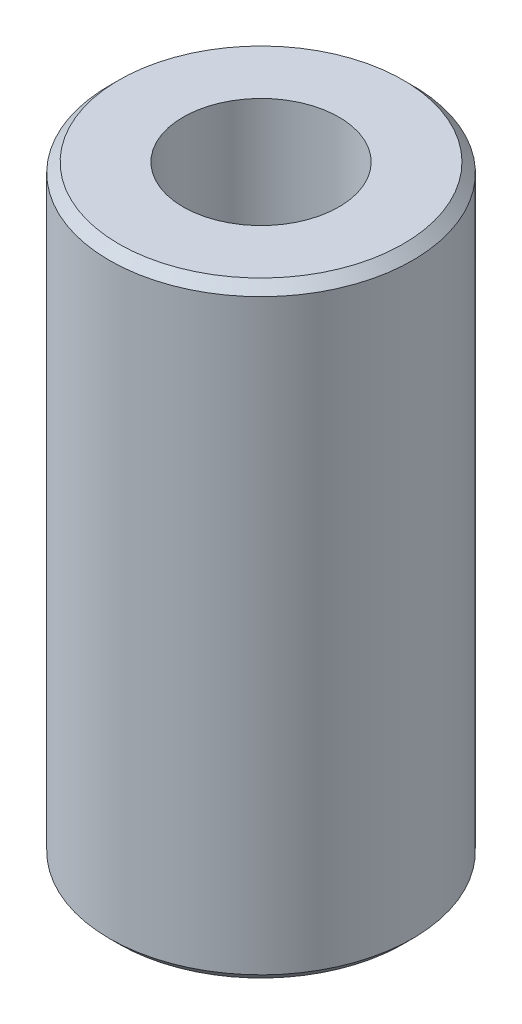
ISO-10303-21;
HEADER;
FILE_DESCRIPTION(('STEP AP214'),'2;1');
FILE_NAME('part.step','',(''),(''),'','','');
FILE_SCHEMA(('AUTOMOTIVE_DESIGN { 1 0 10303 214 1 1 1 1 }'));
ENDSEC;
DATA;
#1=APPLICATION_CONTEXT('core data for automotive mechanical design processes');
#2=APPLICATION_PROTOCOL_DEFINITION('international standard','automotive_design',2000,#1);
#3=PRODUCT_CONTEXT('',#1,'mechanical');
#4=PRODUCT('Part','Part','',(#3));
#5=PRODUCT_RELATED_PRODUCT_CATEGORY('part','',(#4));
#6=PRODUCT_DEFINITION_FORMATION('','',#4);
#7=PRODUCT_DEFINITION_CONTEXT('part definition',#1,'design');
#8=PRODUCT_DEFINITION('design','',#6,#7);
#9=PRODUCT_DEFINITION_SHAPE('','',#8);
#10=(LENGTH_UNIT() NAMED_UNIT(*) SI_UNIT(.MILLI.,.METRE.));
#11=(NAMED_UNIT(*) PLANE_ANGLE_UNIT() SI_UNIT($,.RADIAN.));
#12=(NAMED_UNIT(*) SI_UNIT($,.STERADIAN.) SOLID_ANGLE_UNIT());
#13=UNCERTAINTY_MEASURE_WITH_UNIT(LENGTH_MEASURE(1.E-05),#10,'distance_accuracy_value','');
#14=(GEOMETRIC_REPRESENTATION_CONTEXT(3) GLOBAL_UNCERTAINTY_ASSIGNED_CONTEXT((#13)) GLOBAL_UNIT_ASSIGNED_CONTEXT((#10,
#11,#12)) REPRESENTATION_CONTEXT('',''));
#15=CARTESIAN_POINT('',(0.,0.,0.));
#16=DIRECTION('',(0.,0.,1.));
#17=DIRECTION('',(1.,0.,0.));
#18=AXIS2_PLACEMENT_3D('',#15,#16,#17);
#19=CARTESIAN_POINT('',(0.,12.7,0.));
#20=DIRECTION('',(0.,-1.,0.));
#21=DIRECTION('',(0.,0.,-1.));
#22=AXIS2_PLACEMENT_3D('',#19,#20,#21);
#23=CYLINDRICAL_SURFACE('',#22,6.35);
#24=CARTESIAN_POINT('',(0.,-12.303125,0.));
#25=DIRECTION('',(0.,1.,0.));
#26=DIRECTION('',(0.,0.,1.));
#27=AXIS2_PLACEMENT_3D('',#24,#25,#26);
#28=CIRCLE('',#27,6.35);
#29=CARTESIAN_POINT('',(0.,-12.303125,6.35));
#30=VERTEX_POINT('',#29);
#31=EDGE_CURVE('E45',#30,#30,#28,.T.);
#32=ORIENTED_EDGE('',*,*,#31,.T.);
#33=EDGE_LOOP('',(#32));
#34=FACE_BOUND('',#33,.T.);
#35=CARTESIAN_POINT('',(0.,12.303125,0.));
#36=DIRECTION('',(0.,1.,0.));
#37=DIRECTION('',(0.,0.,1.));
#38=AXIS2_PLACEMENT_3D('',#35,#36,#37);
#39=CIRCLE('',#38,6.35);
#40=CARTESIAN_POINT('',(0.,12.303125,6.35));
#41=VERTEX_POINT('',#40);
#42=EDGE_CURVE('E49',#41,#41,#39,.F.);
#43=ORIENTED_EDGE('',*,*,#42,.T.);
#44=EDGE_LOOP('',(#43));
#45=FACE_BOUND('',#44,.T.);
#46=ADVANCED_FACE('F33',(#34,#45),#23,.T.);
#47=CARTESIAN_POINT('',(0.,12.7,0.));
#48=DIRECTION('',(0.,1.,0.));
#49=DIRECTION('',(0.,0.,1.));
#50=AXIS2_PLACEMENT_3D('',#47,#48,#49);
#51=PLANE('',#50);
#52=CARTESIAN_POINT('',(0.,12.7,0.));
#53=DIRECTION('',(0.,1.,0.));
#54=DIRECTION('',(0.,0.,1.));
#55=AXIS2_PLACEMENT_3D('',#52,#53,#54);
#56=CIRCLE('',#55,3.2639);
#57=CARTESIAN_POINT('',(0.,12.7,3.2639));
#58=VERTEX_POINT('',#57);
#59=EDGE_CURVE('E57',#58,#58,#56,.T.);
#60=ORIENTED_EDGE('',*,*,#59,.F.);
#61=EDGE_LOOP('',(#60));
#62=FACE_BOUND('',#61,.T.);
#63=CARTESIAN_POINT('',(0.,12.7,0.));
#64=DIRECTION('',(0.,1.,0.));
#65=DIRECTION('',(0.,0.,1.));
#66=AXIS2_PLACEMENT_3D('',#63,#64,#65);
#67=CIRCLE('',#66,5.953125);
#68=CARTESIAN_POINT('',(0.,12.7,5.953125));
#69=VERTEX_POINT('',#68);
#70=EDGE_CURVE('E10',#69,#69,#67,.T.);
#71=ORIENTED_EDGE('',*,*,#70,.T.);
#72=EDGE_LOOP('',(#71));
#73=FACE_BOUND('',#72,.T.);
#74=ADVANCED_FACE('F63',(#62,#73),#51,.T.);
#75=CARTESIAN_POINT('',(0.,-12.7,0.));
#76=DIRECTION('',(0.,1.,0.));
#77=DIRECTION('',(0.,0.,1.));
#78=AXIS2_PLACEMENT_3D('',#75,#76,#77);
#79=PLANE('',#78);
#80=CARTESIAN_POINT('',(0.,-12.7,0.));
#81=DIRECTION('',(0.,1.,0.));
#82=DIRECTION('',(0.,0.,1.));
#83=AXIS2_PLACEMENT_3D('',#80,#81,#82);
#84=CIRCLE('',#83,3.2639);
#85=CARTESIAN_POINT('',(0.,-12.7,3.2639));
#86=VERTEX_POINT('',#85);
#87=EDGE_CURVE('E54',#86,#86,#84,.T.);
#88=ORIENTED_EDGE('',*,*,#87,.T.);
#89=EDGE_LOOP('',(#88));
#90=FACE_BOUND('',#89,.T.);
#91=CARTESIAN_POINT('',(0.,-12.7,0.));
#92=DIRECTION('',(0.,1.,0.));
#93=DIRECTION('',(0.,0.,1.));
#94=AXIS2_PLACEMENT_3D('',#91,#92,#93);
#95=CIRCLE('',#94,5.953125);
#96=CARTESIAN_POINT('',(0.,-12.7,5.953125));
#97=VERTEX_POINT('',#96);
#98=EDGE_CURVE('E41',#97,#97,#95,.F.);
#99=ORIENTED_EDGE('',*,*,#98,.T.);
#100=EDGE_LOOP('',(#99));
#101=FACE_BOUND('',#100,.T.);
#102=ADVANCED_FACE('F65',(#90,#101),#79,.F.);
#103=CARTESIAN_POINT('',(0.,-12.303125,0.));
#104=DIRECTION('',(0.,1.,0.));
#105=DIRECTION('',(0.,0.,1.));
#106=AXIS2_PLACEMENT_3D('',#103,#104,#105);
#107=CONICAL_SURFACE('',#106,6.35,0.785398163397452);
#108=ORIENTED_EDGE('',*,*,#98,.F.);
#109=EDGE_LOOP('',(#108));
#110=FACE_BOUND('',#109,.T.);
#111=ORIENTED_EDGE('',*,*,#31,.F.);
#112=EDGE_LOOP('',(#111));
#113=FACE_BOUND('',#112,.T.);
#114=ADVANCED_FACE('F71',(#110,#113),#107,.T.);
#115=CARTESIAN_POINT('',(0.,12.7,0.));
#116=DIRECTION('',(0.,-1.,0.));
#117=DIRECTION('',(0.,0.,-1.));
#118=AXIS2_PLACEMENT_3D('',#115,#116,#117);
#119=CONICAL_SURFACE('',#118,5.953125,0.785398163397444);
#120=ORIENTED_EDGE('',*,*,#42,.F.);
#121=EDGE_LOOP('',(#120));
#122=FACE_BOUND('',#121,.T.);
#123=ORIENTED_EDGE('',*,*,#70,.F.);
#124=EDGE_LOOP('',(#123));
#125=FACE_BOUND('',#124,.T.);
#126=ADVANCED_FACE('F36',(#122,#125),#119,.T.);
#127=CARTESIAN_POINT('',(0.,-12.7,0.));
#128=DIRECTION('',(0.,1.,0.));
#129=DIRECTION('',(0.,0.,1.));
#130=AXIS2_PLACEMENT_3D('',#127,#128,#129);
#131=CYLINDRICAL_SURFACE('',#130,3.2639);
#132=ORIENTED_EDGE('',*,*,#87,.F.);
#133=EDGE_LOOP('',(#132));
#134=FACE_BOUND('',#133,.T.);
#135=ORIENTED_EDGE('',*,*,#59,.T.);
#136=EDGE_LOOP('',(#135));
#137=FACE_BOUND('',#136,.T.);
#138=ADVANCED_FACE('F61',(#134,#137),#131,.F.);
#139=CLOSED_SHELL('',(#46,#74,#102,#114,#126,#138));
#140=MANIFOLD_SOLID_BREP('B2',#139);
#141=ADVANCED_BREP_SHAPE_REPRESENTATION('',(#18,#140),#14);
#142=SHAPE_DEFINITION_REPRESENTATION(#9,#141);
ENDSEC;
END-ISO-10303-21;
